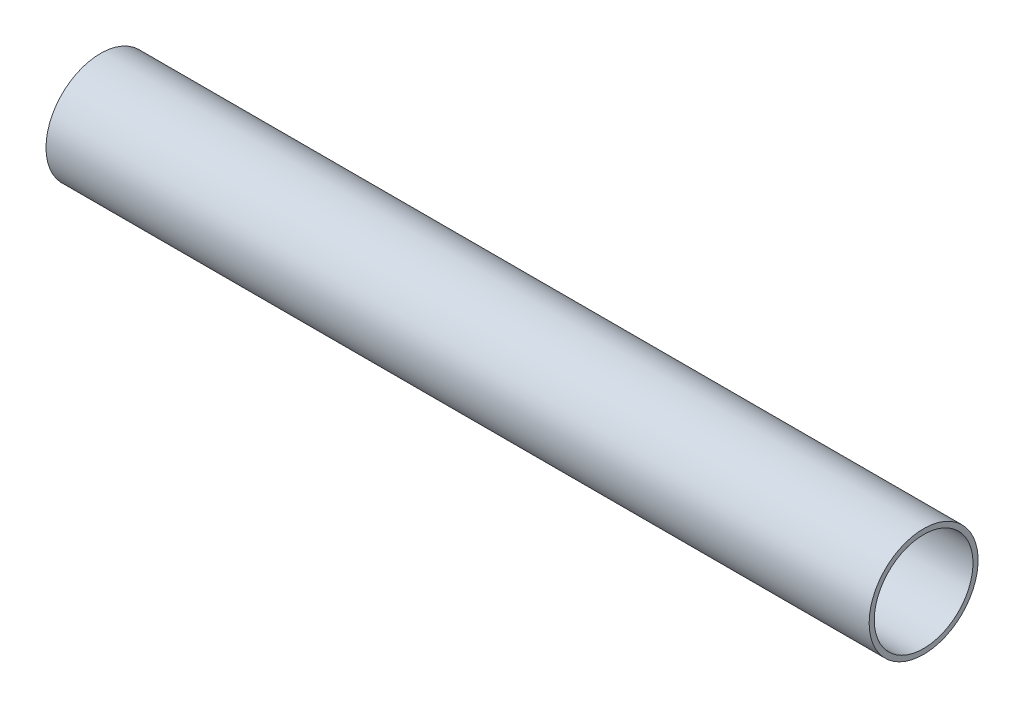
ISO-10303-21;
HEADER;
FILE_DESCRIPTION(('STEP AP214'),'2;1');
FILE_NAME('part.step','',(''),(''),'','','');
FILE_SCHEMA(('AUTOMOTIVE_DESIGN { 1 0 10303 214 1 1 1 1 }'));
ENDSEC;
DATA;
#1=APPLICATION_CONTEXT('core data for automotive mechanical design processes');
#2=APPLICATION_PROTOCOL_DEFINITION('international standard','automotive_design',2000,#1);
#3=PRODUCT_CONTEXT('',#1,'mechanical');
#4=PRODUCT('Part','Part','',(#3));
#5=PRODUCT_RELATED_PRODUCT_CATEGORY('part','',(#4));
#6=PRODUCT_DEFINITION_FORMATION('','',#4);
#7=PRODUCT_DEFINITION_CONTEXT('part definition',#1,'design');
#8=PRODUCT_DEFINITION('design','',#6,#7);
#9=PRODUCT_DEFINITION_SHAPE('','',#8);
#10=(LENGTH_UNIT() NAMED_UNIT(*) SI_UNIT(.MILLI.,.METRE.));
#11=(NAMED_UNIT(*) PLANE_ANGLE_UNIT() SI_UNIT($,.RADIAN.));
#12=(NAMED_UNIT(*) SI_UNIT($,.STERADIAN.) SOLID_ANGLE_UNIT());
#13=UNCERTAINTY_MEASURE_WITH_UNIT(LENGTH_MEASURE(1.E-05),#10,'distance_accuracy_value','');
#14=(GEOMETRIC_REPRESENTATION_CONTEXT(3) GLOBAL_UNCERTAINTY_ASSIGNED_CONTEXT((#13)) GLOBAL_UNIT_ASSIGNED_CONTEXT((#10,
#11,#12)) REPRESENTATION_CONTEXT('',''));
#15=CARTESIAN_POINT('',(0.,0.,0.));
#16=DIRECTION('',(0.,0.,1.));
#17=DIRECTION('',(1.,0.,0.));
#18=AXIS2_PLACEMENT_3D('',#15,#16,#17);
#19=CARTESIAN_POINT('',(0.,13.5,0.));
#20=DIRECTION('',(1.,0.,0.));
#21=DIRECTION('',(0.,0.,-1.));
#22=AXIS2_PLACEMENT_3D('',#19,#20,#21);
#23=PLANE('',#22);
#24=CARTESIAN_POINT('',(0.,0.,0.));
#25=DIRECTION('',(-1.,0.,0.));
#26=DIRECTION('',(0.,0.,1.));
#27=AXIS2_PLACEMENT_3D('',#24,#25,#26);
#28=CIRCLE('',#27,13.5);
#29=CARTESIAN_POINT('',(0.,0.,13.5));
#30=VERTEX_POINT('',#29);
#31=EDGE_CURVE('E51',#30,#30,#28,.T.);
#32=ORIENTED_EDGE('',*,*,#31,.F.);
#33=EDGE_LOOP('',(#32));
#34=FACE_BOUND('',#33,.T.);
#35=CARTESIAN_POINT('',(0.,0.,0.));
#36=DIRECTION('',(-1.,0.,0.));
#37=DIRECTION('',(0.,0.,1.));
#38=AXIS2_PLACEMENT_3D('',#35,#36,#37);
#39=CIRCLE('',#38,14.9);
#40=CARTESIAN_POINT('',(0.,0.,14.9));
#41=VERTEX_POINT('',#40);
#42=EDGE_CURVE('E10',#41,#41,#39,.T.);
#43=ORIENTED_EDGE('',*,*,#42,.T.);
#44=EDGE_LOOP('',(#43));
#45=FACE_BOUND('',#44,.T.);
#46=ADVANCED_FACE('F40',(#34,#45),#23,.F.);
#47=CARTESIAN_POINT('',(0.,0.,0.));
#48=DIRECTION('',(-1.,0.,0.));
#49=DIRECTION('',(0.,0.,1.));
#50=AXIS2_PLACEMENT_3D('',#47,#48,#49);
#51=CYLINDRICAL_SURFACE('',#50,14.9);
#52=ORIENTED_EDGE('',*,*,#42,.F.);
#53=EDGE_LOOP('',(#52));
#54=FACE_BOUND('',#53,.T.);
#55=CARTESIAN_POINT('',(225.11,0.,0.));
#56=DIRECTION('',(-1.,0.,0.));
#57=DIRECTION('',(0.,0.,1.));
#58=AXIS2_PLACEMENT_3D('',#55,#56,#57);
#59=CIRCLE('',#58,14.9);
#60=CARTESIAN_POINT('',(225.11,0.,14.9));
#61=VERTEX_POINT('',#60);
#62=EDGE_CURVE('E43',#61,#61,#59,.T.);
#63=ORIENTED_EDGE('',*,*,#62,.T.);
#64=EDGE_LOOP('',(#63));
#65=FACE_BOUND('',#64,.T.);
#66=ADVANCED_FACE('F58',(#54,#65),#51,.T.);
#67=CARTESIAN_POINT('',(225.11,14.9,0.));
#68=DIRECTION('',(-1.,0.,0.));
#69=DIRECTION('',(0.,0.,1.));
#70=AXIS2_PLACEMENT_3D('',#67,#68,#69);
#71=PLANE('',#70);
#72=ORIENTED_EDGE('',*,*,#62,.F.);
#73=EDGE_LOOP('',(#72));
#74=FACE_BOUND('',#73,.T.);
#75=CARTESIAN_POINT('',(225.11,0.,0.));
#76=DIRECTION('',(-1.,0.,0.));
#77=DIRECTION('',(0.,0.,1.));
#78=AXIS2_PLACEMENT_3D('',#75,#76,#77);
#79=CIRCLE('',#78,13.5);
#80=CARTESIAN_POINT('',(225.11,0.,13.5));
#81=VERTEX_POINT('',#80);
#82=EDGE_CURVE('E50',#81,#81,#79,.T.);
#83=ORIENTED_EDGE('',*,*,#82,.T.);
#84=EDGE_LOOP('',(#83));
#85=FACE_BOUND('',#84,.T.);
#86=ADVANCED_FACE('F61',(#74,#85),#71,.F.);
#87=CARTESIAN_POINT('',(0.,0.,0.));
#88=DIRECTION('',(-1.,0.,0.));
#89=DIRECTION('',(0.,0.,1.));
#90=AXIS2_PLACEMENT_3D('',#87,#88,#89);
#91=CYLINDRICAL_SURFACE('',#90,13.5);
#92=ORIENTED_EDGE('',*,*,#82,.F.);
#93=EDGE_LOOP('',(#92));
#94=FACE_BOUND('',#93,.T.);
#95=ORIENTED_EDGE('',*,*,#31,.T.);
#96=EDGE_LOOP('',(#95));
#97=FACE_BOUND('',#96,.T.);
#98=ADVANCED_FACE('F60',(#94,#97),#91,.F.);
#99=CLOSED_SHELL('',(#46,#66,#86,#98));
#100=MANIFOLD_SOLID_BREP('B2',#99);
#101=ADVANCED_BREP_SHAPE_REPRESENTATION('',(#18,#100),#14);
#102=SHAPE_DEFINITION_REPRESENTATION(#9,#101);
ENDSEC;
END-ISO-10303-21;
